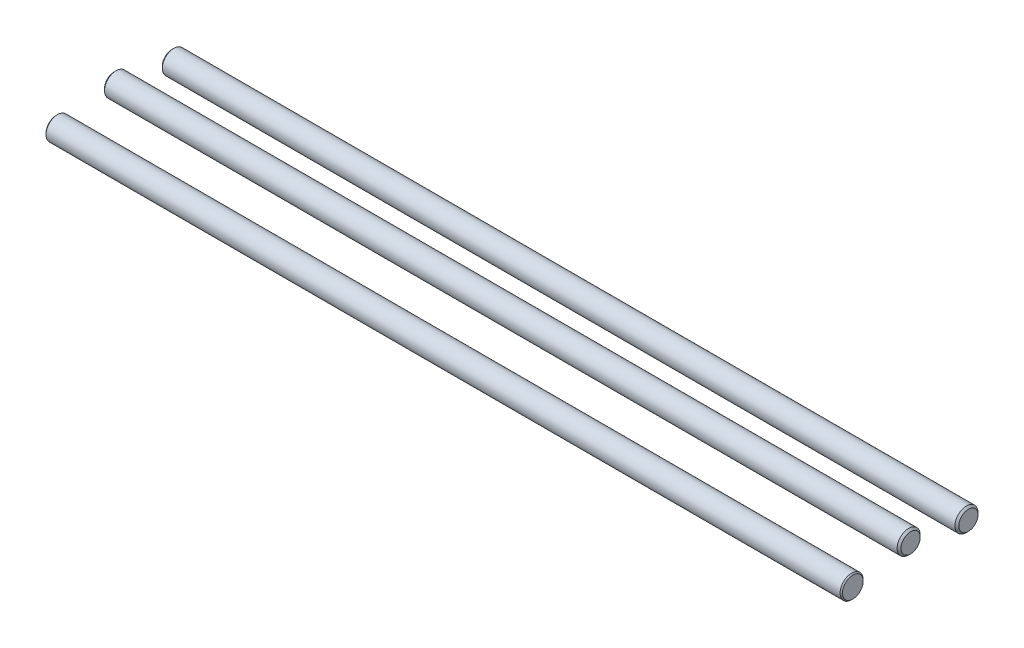
ISO-10303-21;
HEADER;
FILE_DESCRIPTION(('STEP AP214'),'2;1');
FILE_NAME('part.step','',(''),(''),'','','');
FILE_SCHEMA(('AUTOMOTIVE_DESIGN { 1 0 10303 214 1 1 1 1 }'));
ENDSEC;
DATA;
#1=APPLICATION_CONTEXT('core data for automotive mechanical design processes');
#2=APPLICATION_PROTOCOL_DEFINITION('international standard','automotive_design',2000,#1);
#3=PRODUCT_CONTEXT('',#1,'mechanical');
#4=PRODUCT('Part','Part','',(#3));
#5=PRODUCT_RELATED_PRODUCT_CATEGORY('part','',(#4));
#6=PRODUCT_DEFINITION_FORMATION('','',#4);
#7=PRODUCT_DEFINITION_CONTEXT('part definition',#1,'design');
#8=PRODUCT_DEFINITION('design','',#6,#7);
#9=PRODUCT_DEFINITION_SHAPE('','',#8);
#10=(LENGTH_UNIT() NAMED_UNIT(*) SI_UNIT(.MILLI.,.METRE.));
#11=(NAMED_UNIT(*) PLANE_ANGLE_UNIT() SI_UNIT($,.RADIAN.));
#12=(NAMED_UNIT(*) SI_UNIT($,.STERADIAN.) SOLID_ANGLE_UNIT());
#13=UNCERTAINTY_MEASURE_WITH_UNIT(LENGTH_MEASURE(1.E-05),#10,'distance_accuracy_value','');
#14=(GEOMETRIC_REPRESENTATION_CONTEXT(3) GLOBAL_UNCERTAINTY_ASSIGNED_CONTEXT((#13)) GLOBAL_UNIT_ASSIGNED_CONTEXT((#10,
#11,#12)) REPRESENTATION_CONTEXT('',''));
#15=CARTESIAN_POINT('',(0.,0.,0.));
#16=DIRECTION('',(0.,0.,1.));
#17=DIRECTION('',(1.,0.,0.));
#18=AXIS2_PLACEMENT_3D('',#15,#16,#17);
#19=CARTESIAN_POINT('',(-140.1,-2.45788509735983,-15.));
#20=DIRECTION('',(1.,0.,0.));
#21=DIRECTION('',(0.,0.,-1.));
#22=AXIS2_PLACEMENT_3D('',#19,#20,#21);
#23=CYLINDRICAL_SURFACE('',#22,3.);
#24=CARTESIAN_POINT('',(-37.2,-2.45788509735983,-15.));
#25=DIRECTION('',(1.,0.,0.));
#26=DIRECTION('',(0.,0.,-1.));
#27=AXIS2_PLACEMENT_3D('',#24,#25,#26);
#28=CIRCLE('',#27,3.);
#29=CARTESIAN_POINT('',(-37.2,-2.45788509735983,-18.));
#30=VERTEX_POINT('',#29);
#31=EDGE_CURVE('E11',#30,#30,#28,.F.);
#32=ORIENTED_EDGE('',*,*,#31,.T.);
#33=EDGE_LOOP('',(#32));
#34=FACE_BOUND('',#33,.T.);
#35=CARTESIAN_POINT('',(-243.,-2.45788509735983,-15.));
#36=DIRECTION('',(1.,0.,0.));
#37=DIRECTION('',(0.,0.,-1.));
#38=AXIS2_PLACEMENT_3D('',#35,#36,#37);
#39=CIRCLE('',#38,3.);
#40=CARTESIAN_POINT('',(-243.,-2.45788509735983,-18.));
#41=VERTEX_POINT('',#40);
#42=EDGE_CURVE('E58',#41,#41,#39,.F.);
#43=ORIENTED_EDGE('',*,*,#42,.F.);
#44=EDGE_LOOP('',(#43));
#45=FACE_BOUND('',#44,.T.);
#46=ADVANCED_FACE('F46',(#34,#45),#23,.T.);
#47=CARTESIAN_POINT('',(-36.7000000000001,-2.45788509735983,-15.));
#48=DIRECTION('',(1.,0.,0.));
#49=DIRECTION('',(0.,0.,-1.));
#50=AXIS2_PLACEMENT_3D('',#47,#48,#49);
#51=PLANE('',#50);
#52=CARTESIAN_POINT('',(-36.7000000000001,-2.45788509735983,-15.));
#53=DIRECTION('',(1.,0.,0.));
#54=DIRECTION('',(0.,0.,-1.));
#55=AXIS2_PLACEMENT_3D('',#52,#53,#54);
#56=CIRCLE('',#55,2.50000000000002);
#57=CARTESIAN_POINT('',(-36.7000000000001,-2.45788509735983,-17.5));
#58=VERTEX_POINT('',#57);
#59=EDGE_CURVE('E54',#58,#58,#56,.T.);
#60=ORIENTED_EDGE('',*,*,#59,.T.);
#61=EDGE_LOOP('',(#60));
#62=FACE_BOUND('',#61,.T.);
#63=ADVANCED_FACE('F79',(#62),#51,.T.);
#64=CARTESIAN_POINT('',(-36.7000000000001,-2.45788509735983,-15.));
#65=DIRECTION('',(-1.,0.,0.));
#66=DIRECTION('',(0.,0.,1.));
#67=AXIS2_PLACEMENT_3D('',#64,#65,#66);
#68=CONICAL_SURFACE('',#67,2.50000000000002,0.785398163397447);
#69=ORIENTED_EDGE('',*,*,#31,.F.);
#70=EDGE_LOOP('',(#69));
#71=FACE_BOUND('',#70,.T.);
#72=ORIENTED_EDGE('',*,*,#59,.F.);
#73=EDGE_LOOP('',(#72));
#74=FACE_BOUND('',#73,.T.);
#75=ADVANCED_FACE('F49',(#71,#74),#68,.T.);
#76=CARTESIAN_POINT('',(-243.5,-2.45788509735983,-15.));
#77=DIRECTION('',(-1.,0.,0.));
#78=DIRECTION('',(0.,0.,-1.));
#79=AXIS2_PLACEMENT_3D('',#76,#77,#78);
#80=PLANE('',#79);
#81=CARTESIAN_POINT('',(-243.5,-2.45788509735983,-15.));
#82=DIRECTION('',(1.,0.,0.));
#83=DIRECTION('',(0.,0.,-1.));
#84=AXIS2_PLACEMENT_3D('',#81,#82,#83);
#85=CIRCLE('',#84,2.50000000000002);
#86=CARTESIAN_POINT('',(-243.5,-2.45788509735983,-17.5));
#87=VERTEX_POINT('',#86);
#88=EDGE_CURVE('E62',#87,#87,#85,.T.);
#89=ORIENTED_EDGE('',*,*,#88,.F.);
#90=EDGE_LOOP('',(#89));
#91=FACE_BOUND('',#90,.T.);
#92=ADVANCED_FACE('F70',(#91),#80,.T.);
#93=CARTESIAN_POINT('',(-243.5,-2.45788509735983,-15.));
#94=DIRECTION('',(1.,0.,0.));
#95=DIRECTION('',(0.,0.,1.));
#96=AXIS2_PLACEMENT_3D('',#93,#94,#95);
#97=CONICAL_SURFACE('',#96,2.50000000000002,0.785398163397447);
#98=ORIENTED_EDGE('',*,*,#42,.T.);
#99=EDGE_LOOP('',(#98));
#100=FACE_BOUND('',#99,.T.);
#101=ORIENTED_EDGE('',*,*,#88,.T.);
#102=EDGE_LOOP('',(#101));
#103=FACE_BOUND('',#102,.T.);
#104=ADVANCED_FACE('F68',(#100,#103),#97,.T.);
#105=CLOSED_SHELL('',(#46,#63,#75,#92,#104));
#106=MANIFOLD_SOLID_BREP('B2',#105);
#107=CARTESIAN_POINT('',(-140.1,-2.45788509735983,15.));
#108=DIRECTION('',(1.,0.,0.));
#109=DIRECTION('',(0.,0.,-1.));
#110=AXIS2_PLACEMENT_3D('',#107,#108,#109);
#111=CYLINDRICAL_SURFACE('',#110,3.);
#112=CARTESIAN_POINT('',(-37.,-2.45788509735983,15.));
#113=DIRECTION('',(1.,0.,0.));
#114=DIRECTION('',(0.,0.,-1.));
#115=AXIS2_PLACEMENT_3D('',#112,#113,#114);
#116=CIRCLE('',#115,3.);
#117=CARTESIAN_POINT('',(-37.,-2.45788509735983,12.));
#118=VERTEX_POINT('',#117);
#119=EDGE_CURVE('E45',#118,#118,#116,.F.);
#120=ORIENTED_EDGE('',*,*,#119,.T.);
#121=EDGE_LOOP('',(#120));
#122=FACE_BOUND('',#121,.T.);
#123=CARTESIAN_POINT('',(-243.2,-2.45788509735983,15.));
#124=DIRECTION('',(1.,0.,0.));
#125=DIRECTION('',(0.,0.,-1.));
#126=AXIS2_PLACEMENT_3D('',#123,#124,#125);
#127=CIRCLE('',#126,3.);
#128=CARTESIAN_POINT('',(-243.2,-2.45788509735983,12.));
#129=VERTEX_POINT('',#128);
#130=EDGE_CURVE('E152',#129,#129,#127,.F.);
#131=ORIENTED_EDGE('',*,*,#130,.F.);
#132=EDGE_LOOP('',(#131));
#133=FACE_BOUND('',#132,.T.);
#134=ADVANCED_FACE('F140',(#122,#133),#111,.T.);
#135=CARTESIAN_POINT('',(-36.7000000000001,-2.45788509735983,15.));
#136=DIRECTION('',(1.,0.,0.));
#137=DIRECTION('',(0.,0.,-1.));
#138=AXIS2_PLACEMENT_3D('',#135,#136,#137);
#139=PLANE('',#138);
#140=CARTESIAN_POINT('',(-36.7000000000001,-2.45788509735983,15.));
#141=DIRECTION('',(1.,0.,0.));
#142=DIRECTION('',(0.,0.,-1.));
#143=AXIS2_PLACEMENT_3D('',#140,#141,#142);
#144=CIRCLE('',#143,2.69999999999999);
#145=CARTESIAN_POINT('',(-36.7000000000001,-2.45788509735983,12.3));
#146=VERTEX_POINT('',#145);
#147=EDGE_CURVE('E148',#146,#146,#144,.T.);
#148=ORIENTED_EDGE('',*,*,#147,.T.);
#149=EDGE_LOOP('',(#148));
#150=FACE_BOUND('',#149,.T.);
#151=ADVANCED_FACE('F173',(#150),#139,.T.);
#152=CARTESIAN_POINT('',(-36.7000000000001,-2.45788509735983,15.));
#153=DIRECTION('',(-1.,0.,0.));
#154=DIRECTION('',(0.,0.,1.));
#155=AXIS2_PLACEMENT_3D('',#152,#153,#154);
#156=CONICAL_SURFACE('',#155,2.69999999999999,0.785398163397469);
#157=ORIENTED_EDGE('',*,*,#119,.F.);
#158=EDGE_LOOP('',(#157));
#159=FACE_BOUND('',#158,.T.);
#160=ORIENTED_EDGE('',*,*,#147,.F.);
#161=EDGE_LOOP('',(#160));
#162=FACE_BOUND('',#161,.T.);
#163=ADVANCED_FACE('F143',(#159,#162),#156,.T.);
#164=CARTESIAN_POINT('',(-243.5,-2.45788509735983,15.));
#165=DIRECTION('',(-1.,0.,0.));
#166=DIRECTION('',(0.,0.,-1.));
#167=AXIS2_PLACEMENT_3D('',#164,#165,#166);
#168=PLANE('',#167);
#169=CARTESIAN_POINT('',(-243.5,-2.45788509735983,15.));
#170=DIRECTION('',(1.,0.,0.));
#171=DIRECTION('',(0.,0.,-1.));
#172=AXIS2_PLACEMENT_3D('',#169,#170,#171);
#173=CIRCLE('',#172,2.69999999999999);
#174=CARTESIAN_POINT('',(-243.5,-2.45788509735983,12.3));
#175=VERTEX_POINT('',#174);
#176=EDGE_CURVE('E156',#175,#175,#173,.T.);
#177=ORIENTED_EDGE('',*,*,#176,.F.);
#178=EDGE_LOOP('',(#177));
#179=FACE_BOUND('',#178,.T.);
#180=ADVANCED_FACE('F164',(#179),#168,.T.);
#181=CARTESIAN_POINT('',(-243.5,-2.45788509735983,15.));
#182=DIRECTION('',(1.,0.,0.));
#183=DIRECTION('',(0.,0.,1.));
#184=AXIS2_PLACEMENT_3D('',#181,#182,#183);
#185=CONICAL_SURFACE('',#184,2.69999999999999,0.785398163397469);
#186=ORIENTED_EDGE('',*,*,#130,.T.);
#187=EDGE_LOOP('',(#186));
#188=FACE_BOUND('',#187,.T.);
#189=ORIENTED_EDGE('',*,*,#176,.T.);
#190=EDGE_LOOP('',(#189));
#191=FACE_BOUND('',#190,.T.);
#192=ADVANCED_FACE('F162',(#188,#191),#185,.T.);
#193=CLOSED_SHELL('',(#134,#151,#163,#180,#192));
#194=MANIFOLD_SOLID_BREP('B6',#193);
#195=CARTESIAN_POINT('',(-140.1,0.,0.));
#196=DIRECTION('',(1.,0.,0.));
#197=DIRECTION('',(0.,0.,-1.));
#198=AXIS2_PLACEMENT_3D('',#195,#196,#197);
#199=CYLINDRICAL_SURFACE('',#198,3.);
#200=CARTESIAN_POINT('',(-37.2,0.,0.));
#201=DIRECTION('',(1.,0.,0.));
#202=DIRECTION('',(0.,0.,-1.));
#203=AXIS2_PLACEMENT_3D('',#200,#201,#202);
#204=CIRCLE('',#203,3.);
#205=CARTESIAN_POINT('',(-37.2,0.,-3.));
#206=VERTEX_POINT('',#205);
#207=EDGE_CURVE('E139',#206,#206,#204,.F.);
#208=ORIENTED_EDGE('',*,*,#207,.T.);
#209=EDGE_LOOP('',(#208));
#210=FACE_BOUND('',#209,.T.);
#211=CARTESIAN_POINT('',(-243.,0.,0.));
#212=DIRECTION('',(1.,0.,0.));
#213=DIRECTION('',(0.,0.,-1.));
#214=AXIS2_PLACEMENT_3D('',#211,#212,#213);
#215=CIRCLE('',#214,3.);
#216=CARTESIAN_POINT('',(-243.,0.,-3.));
#217=VERTEX_POINT('',#216);
#218=EDGE_CURVE('E239',#217,#217,#215,.F.);
#219=ORIENTED_EDGE('',*,*,#218,.F.);
#220=EDGE_LOOP('',(#219));
#221=FACE_BOUND('',#220,.T.);
#222=ADVANCED_FACE('F227',(#210,#221),#199,.T.);
#223=CARTESIAN_POINT('',(-36.7000000000001,0.,0.));
#224=DIRECTION('',(1.,0.,0.));
#225=DIRECTION('',(0.,0.,-1.));
#226=AXIS2_PLACEMENT_3D('',#223,#224,#225);
#227=PLANE('',#226);
#228=CARTESIAN_POINT('',(-36.7000000000001,0.,0.));
#229=DIRECTION('',(1.,0.,0.));
#230=DIRECTION('',(0.,0.,-1.));
#231=AXIS2_PLACEMENT_3D('',#228,#229,#230);
#232=CIRCLE('',#231,2.50000000000002);
#233=CARTESIAN_POINT('',(-36.7000000000001,0.,-2.50000000000002));
#234=VERTEX_POINT('',#233);
#235=EDGE_CURVE('E235',#234,#234,#232,.T.);
#236=ORIENTED_EDGE('',*,*,#235,.T.);
#237=EDGE_LOOP('',(#236));
#238=FACE_BOUND('',#237,.T.);
#239=ADVANCED_FACE('F260',(#238),#227,.T.);
#240=CARTESIAN_POINT('',(-36.7000000000001,0.,0.));
#241=DIRECTION('',(-1.,0.,0.));
#242=DIRECTION('',(0.,0.,1.));
#243=AXIS2_PLACEMENT_3D('',#240,#241,#242);
#244=CONICAL_SURFACE('',#243,2.50000000000002,0.785398163397447);
#245=ORIENTED_EDGE('',*,*,#207,.F.);
#246=EDGE_LOOP('',(#245));
#247=FACE_BOUND('',#246,.T.);
#248=ORIENTED_EDGE('',*,*,#235,.F.);
#249=EDGE_LOOP('',(#248));
#250=FACE_BOUND('',#249,.T.);
#251=ADVANCED_FACE('F230',(#247,#250),#244,.T.);
#252=CARTESIAN_POINT('',(-243.5,0.,0.));
#253=DIRECTION('',(-1.,0.,0.));
#254=DIRECTION('',(0.,0.,-1.));
#255=AXIS2_PLACEMENT_3D('',#252,#253,#254);
#256=PLANE('',#255);
#257=CARTESIAN_POINT('',(-243.5,0.,0.));
#258=DIRECTION('',(1.,0.,0.));
#259=DIRECTION('',(0.,0.,-1.));
#260=AXIS2_PLACEMENT_3D('',#257,#258,#259);
#261=CIRCLE('',#260,2.50000000000002);
#262=CARTESIAN_POINT('',(-243.5,0.,-2.50000000000002));
#263=VERTEX_POINT('',#262);
#264=EDGE_CURVE('E243',#263,#263,#261,.T.);
#265=ORIENTED_EDGE('',*,*,#264,.F.);
#266=EDGE_LOOP('',(#265));
#267=FACE_BOUND('',#266,.T.);
#268=ADVANCED_FACE('F251',(#267),#256,.T.);
#269=CARTESIAN_POINT('',(-243.5,0.,0.));
#270=DIRECTION('',(1.,0.,0.));
#271=DIRECTION('',(0.,0.,1.));
#272=AXIS2_PLACEMENT_3D('',#269,#270,#271);
#273=CONICAL_SURFACE('',#272,2.50000000000002,0.785398163397447);
#274=ORIENTED_EDGE('',*,*,#218,.T.);
#275=EDGE_LOOP('',(#274));
#276=FACE_BOUND('',#275,.T.);
#277=ORIENTED_EDGE('',*,*,#264,.T.);
#278=EDGE_LOOP('',(#277));
#279=FACE_BOUND('',#278,.T.);
#280=ADVANCED_FACE('F249',(#276,#279),#273,.T.);
#281=CLOSED_SHELL('',(#222,#239,#251,#268,#280));
#282=MANIFOLD_SOLID_BREP('B40',#281);
#283=ADVANCED_BREP_SHAPE_REPRESENTATION('',(#18,#106,#194,#282),#14);
#284=SHAPE_DEFINITION_REPRESENTATION(#9,#283);
ENDSEC;
END-ISO-10303-21;
